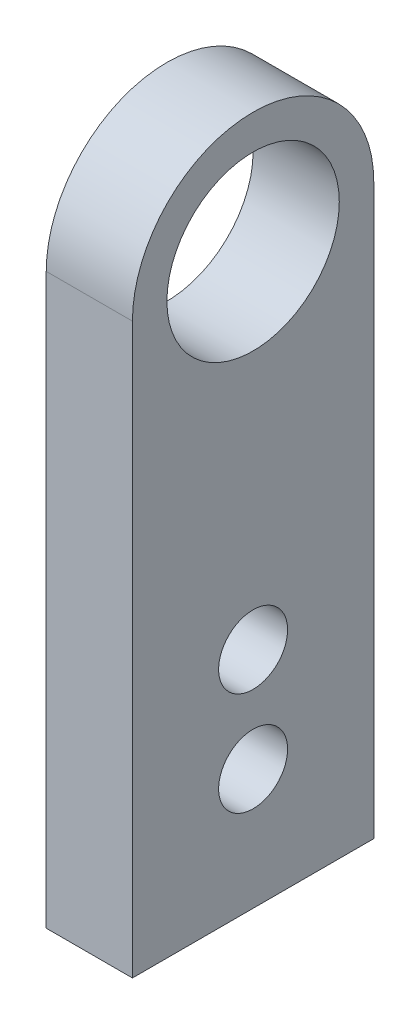
ISO-10303-21;
HEADER;
FILE_DESCRIPTION(('STEP AP214'),'2;1');
FILE_NAME('part.step','',(''),(''),'','','');
FILE_SCHEMA(('AUTOMOTIVE_DESIGN { 1 0 10303 214 1 1 1 1 }'));
ENDSEC;
DATA;
#1=APPLICATION_CONTEXT('core data for automotive mechanical design processes');
#2=APPLICATION_PROTOCOL_DEFINITION('international standard','automotive_design',2000,#1);
#3=PRODUCT_CONTEXT('',#1,'mechanical');
#4=PRODUCT('Part','Part','',(#3));
#5=PRODUCT_RELATED_PRODUCT_CATEGORY('part','',(#4));
#6=PRODUCT_DEFINITION_FORMATION('','',#4);
#7=PRODUCT_DEFINITION_CONTEXT('part definition',#1,'design');
#8=PRODUCT_DEFINITION('design','',#6,#7);
#9=PRODUCT_DEFINITION_SHAPE('','',#8);
#10=(LENGTH_UNIT() NAMED_UNIT(*) SI_UNIT(.MILLI.,.METRE.));
#11=(NAMED_UNIT(*) PLANE_ANGLE_UNIT() SI_UNIT($,.RADIAN.));
#12=(NAMED_UNIT(*) SI_UNIT($,.STERADIAN.) SOLID_ANGLE_UNIT());
#13=UNCERTAINTY_MEASURE_WITH_UNIT(LENGTH_MEASURE(1.E-05),#10,'distance_accuracy_value','');
#14=(GEOMETRIC_REPRESENTATION_CONTEXT(3) GLOBAL_UNCERTAINTY_ASSIGNED_CONTEXT((#13)) GLOBAL_UNIT_ASSIGNED_CONTEXT((#10,
#11,#12)) REPRESENTATION_CONTEXT('',''));
#15=CARTESIAN_POINT('',(0.,0.,0.));
#16=DIRECTION('',(0.,0.,1.));
#17=DIRECTION('',(1.,0.,0.));
#18=AXIS2_PLACEMENT_3D('',#15,#16,#17);
#19=CARTESIAN_POINT('',(5.,33.,0.));
#20=DIRECTION('',(1.,0.,0.));
#21=DIRECTION('',(0.,0.,-1.));
#22=AXIS2_PLACEMENT_3D('',#19,#20,#21);
#23=PLANE('',#22);
#24=CARTESIAN_POINT('',(5.,13.,0.));
#25=DIRECTION('',(1.,0.,0.));
#26=DIRECTION('',(0.,0.,-1.));
#27=AXIS2_PLACEMENT_3D('',#24,#25,#26);
#28=CIRCLE('',#27,2.);
#29=CARTESIAN_POINT('',(5.,13.,-2.));
#30=VERTEX_POINT('',#29);
#31=EDGE_CURVE('E117',#30,#30,#28,.T.);
#32=ORIENTED_EDGE('',*,*,#31,.F.);
#33=EDGE_LOOP('',(#32));
#34=FACE_BOUND('',#33,.T.);
#35=CARTESIAN_POINT('',(5.,33.,0.));
#36=DIRECTION('',(1.,0.,0.));
#37=DIRECTION('',(0.,0.,-1.));
#38=AXIS2_PLACEMENT_3D('',#35,#36,#37);
#39=CIRCLE('',#38,7.);
#40=CARTESIAN_POINT('',(5.,33.,-6.99999999999999));
#41=VERTEX_POINT('',#40);
#42=CARTESIAN_POINT('',(5.,33.,7.));
#43=VERTEX_POINT('',#42);
#44=EDGE_CURVE('E87',#41,#43,#39,.T.);
#45=ORIENTED_EDGE('',*,*,#44,.T.);
#46=DIRECTION('',(0.,-1.,0.));
#47=VECTOR('',#46,1.);
#48=CARTESIAN_POINT('',(5.,33.,7.));
#49=LINE('',#48,#47);
#50=CARTESIAN_POINT('',(5.,0.,7.));
#51=VERTEX_POINT('',#50);
#52=EDGE_CURVE('E82',#43,#51,#49,.T.);
#53=ORIENTED_EDGE('',*,*,#52,.T.);
#54=DIRECTION('',(0.,0.,-1.));
#55=VECTOR('',#54,1.);
#56=CARTESIAN_POINT('',(5.,0.,7.));
#57=LINE('',#56,#55);
#58=CARTESIAN_POINT('',(5.,0.,-7.));
#59=VERTEX_POINT('',#58);
#60=EDGE_CURVE('E85',#51,#59,#57,.T.);
#61=ORIENTED_EDGE('',*,*,#60,.T.);
#62=DIRECTION('',(0.,1.,0.));
#63=VECTOR('',#62,1.);
#64=CARTESIAN_POINT('',(5.,33.,-6.99999999999999));
#65=LINE('',#64,#63);
#66=EDGE_CURVE('E52',#59,#41,#65,.T.);
#67=ORIENTED_EDGE('',*,*,#66,.T.);
#68=EDGE_LOOP('',(#45,#53,#61,#67));
#69=FACE_BOUND('',#68,.T.);
#70=CARTESIAN_POINT('',(5.,33.,0.));
#71=DIRECTION('',(1.,0.,0.));
#72=DIRECTION('',(0.,0.,-1.));
#73=AXIS2_PLACEMENT_3D('',#70,#71,#72);
#74=CIRCLE('',#73,5.);
#75=CARTESIAN_POINT('',(5.,33.,-5.));
#76=VERTEX_POINT('',#75);
#77=EDGE_CURVE('E102',#76,#76,#74,.T.);
#78=ORIENTED_EDGE('',*,*,#77,.F.);
#79=EDGE_LOOP('',(#78));
#80=FACE_BOUND('',#79,.T.);
#81=CARTESIAN_POINT('',(5.,7.,0.));
#82=DIRECTION('',(1.,0.,0.));
#83=DIRECTION('',(0.,0.,-1.));
#84=AXIS2_PLACEMENT_3D('',#81,#82,#83);
#85=CIRCLE('',#84,2.);
#86=CARTESIAN_POINT('',(5.,7.,-2.));
#87=VERTEX_POINT('',#86);
#88=EDGE_CURVE('E123',#87,#87,#85,.T.);
#89=ORIENTED_EDGE('',*,*,#88,.F.);
#90=EDGE_LOOP('',(#89));
#91=FACE_BOUND('',#90,.T.);
#92=ADVANCED_FACE('F35',(#34,#69,#80,#91),#23,.T.);
#93=CARTESIAN_POINT('',(0.,33.,0.));
#94=DIRECTION('',(1.,0.,0.));
#95=DIRECTION('',(0.,0.,-1.));
#96=AXIS2_PLACEMENT_3D('',#93,#94,#95);
#97=PLANE('',#96);
#98=CARTESIAN_POINT('',(0.,33.,0.));
#99=DIRECTION('',(1.,0.,0.));
#100=DIRECTION('',(0.,0.,-1.));
#101=AXIS2_PLACEMENT_3D('',#98,#99,#100);
#102=CIRCLE('',#101,7.);
#103=CARTESIAN_POINT('',(0.,33.,-6.99999999999999));
#104=VERTEX_POINT('',#103);
#105=CARTESIAN_POINT('',(0.,33.,7.));
#106=VERTEX_POINT('',#105);
#107=EDGE_CURVE('E99',#104,#106,#102,.T.);
#108=ORIENTED_EDGE('',*,*,#107,.F.);
#109=DIRECTION('',(0.,1.,0.));
#110=VECTOR('',#109,1.);
#111=CARTESIAN_POINT('',(0.,33.,-6.99999999999999));
#112=LINE('',#111,#110);
#113=CARTESIAN_POINT('',(0.,0.,-7.));
#114=VERTEX_POINT('',#113);
#115=EDGE_CURVE('E75',#114,#104,#112,.T.);
#116=ORIENTED_EDGE('',*,*,#115,.F.);
#117=DIRECTION('',(0.,0.,-1.));
#118=VECTOR('',#117,1.);
#119=CARTESIAN_POINT('',(0.,0.,7.));
#120=LINE('',#119,#118);
#121=CARTESIAN_POINT('',(0.,0.,7.));
#122=VERTEX_POINT('',#121);
#123=EDGE_CURVE('E69',#122,#114,#120,.T.);
#124=ORIENTED_EDGE('',*,*,#123,.F.);
#125=DIRECTION('',(0.,-1.,0.));
#126=VECTOR('',#125,1.);
#127=CARTESIAN_POINT('',(0.,33.,7.));
#128=LINE('',#127,#126);
#129=EDGE_CURVE('E91',#106,#122,#128,.T.);
#130=ORIENTED_EDGE('',*,*,#129,.F.);
#131=EDGE_LOOP('',(#108,#116,#124,#130));
#132=FACE_BOUND('',#131,.T.);
#133=CARTESIAN_POINT('',(0.,33.,0.));
#134=DIRECTION('',(1.,0.,0.));
#135=DIRECTION('',(0.,0.,-1.));
#136=AXIS2_PLACEMENT_3D('',#133,#134,#135);
#137=CIRCLE('',#136,5.);
#138=CARTESIAN_POINT('',(0.,33.,-5.));
#139=VERTEX_POINT('',#138);
#140=EDGE_CURVE('E114',#139,#139,#137,.T.);
#141=ORIENTED_EDGE('',*,*,#140,.T.);
#142=EDGE_LOOP('',(#141));
#143=FACE_BOUND('',#142,.T.);
#144=CARTESIAN_POINT('',(0.,13.,0.));
#145=DIRECTION('',(1.,0.,0.));
#146=DIRECTION('',(0.,0.,-1.));
#147=AXIS2_PLACEMENT_3D('',#144,#145,#146);
#148=CIRCLE('',#147,2.);
#149=CARTESIAN_POINT('',(0.,13.,-2.));
#150=VERTEX_POINT('',#149);
#151=EDGE_CURVE('E120',#150,#150,#148,.T.);
#152=ORIENTED_EDGE('',*,*,#151,.T.);
#153=EDGE_LOOP('',(#152));
#154=FACE_BOUND('',#153,.T.);
#155=CARTESIAN_POINT('',(0.,7.,0.));
#156=DIRECTION('',(1.,0.,0.));
#157=DIRECTION('',(0.,0.,-1.));
#158=AXIS2_PLACEMENT_3D('',#155,#156,#157);
#159=CIRCLE('',#158,2.);
#160=CARTESIAN_POINT('',(0.,7.,-2.));
#161=VERTEX_POINT('',#160);
#162=EDGE_CURVE('E126',#161,#161,#159,.T.);
#163=ORIENTED_EDGE('',*,*,#162,.T.);
#164=EDGE_LOOP('',(#163));
#165=FACE_BOUND('',#164,.T.);
#166=ADVANCED_FACE('F110',(#132,#143,#154,#165),#97,.F.);
#167=CARTESIAN_POINT('',(5.,33.,0.));
#168=DIRECTION('',(-1.,0.,0.));
#169=DIRECTION('',(0.,0.,1.));
#170=AXIS2_PLACEMENT_3D('',#167,#168,#169);
#171=CYLINDRICAL_SURFACE('',#170,7.);
#172=ORIENTED_EDGE('',*,*,#107,.T.);
#173=DIRECTION('',(-1.,0.,0.));
#174=VECTOR('',#173,1.);
#175=CARTESIAN_POINT('',(5.,33.,7.));
#176=LINE('',#175,#174);
#177=EDGE_CURVE('E11',#43,#106,#176,.T.);
#178=ORIENTED_EDGE('',*,*,#177,.F.);
#179=ORIENTED_EDGE('',*,*,#44,.F.);
#180=DIRECTION('',(-1.,0.,0.));
#181=VECTOR('',#180,1.);
#182=CARTESIAN_POINT('',(5.,33.,-6.99999999999999));
#183=LINE('',#182,#181);
#184=EDGE_CURVE('E95',#41,#104,#183,.T.);
#185=ORIENTED_EDGE('',*,*,#184,.T.);
#186=EDGE_LOOP('',(#172,#178,#179,#185));
#187=FACE_BOUND('',#186,.T.);
#188=ADVANCED_FACE('F37',(#187),#171,.T.);
#189=CARTESIAN_POINT('',(5.,33.,7.));
#190=DIRECTION('',(0.,0.,-1.));
#191=DIRECTION('',(0.,1.,0.));
#192=AXIS2_PLACEMENT_3D('',#189,#190,#191);
#193=PLANE('',#192);
#194=ORIENTED_EDGE('',*,*,#129,.T.);
#195=DIRECTION('',(-1.,0.,0.));
#196=VECTOR('',#195,1.);
#197=CARTESIAN_POINT('',(5.,0.,7.));
#198=LINE('',#197,#196);
#199=EDGE_CURVE('E44',#51,#122,#198,.T.);
#200=ORIENTED_EDGE('',*,*,#199,.F.);
#201=ORIENTED_EDGE('',*,*,#52,.F.);
#202=ORIENTED_EDGE('',*,*,#177,.T.);
#203=EDGE_LOOP('',(#194,#200,#201,#202));
#204=FACE_BOUND('',#203,.T.);
#205=ADVANCED_FACE('F90',(#204),#193,.F.);
#206=CARTESIAN_POINT('',(5.,0.,7.));
#207=DIRECTION('',(0.,1.,0.));
#208=DIRECTION('',(0.,0.,1.));
#209=AXIS2_PLACEMENT_3D('',#206,#207,#208);
#210=PLANE('',#209);
#211=ORIENTED_EDGE('',*,*,#123,.T.);
#212=DIRECTION('',(-1.,0.,0.));
#213=VECTOR('',#212,1.);
#214=CARTESIAN_POINT('',(5.,0.,-7.));
#215=LINE('',#214,#213);
#216=EDGE_CURVE('E92',#59,#114,#215,.T.);
#217=ORIENTED_EDGE('',*,*,#216,.F.);
#218=ORIENTED_EDGE('',*,*,#60,.F.);
#219=ORIENTED_EDGE('',*,*,#199,.T.);
#220=EDGE_LOOP('',(#211,#217,#218,#219));
#221=FACE_BOUND('',#220,.T.);
#222=ADVANCED_FACE('F93',(#221),#210,.F.);
#223=CARTESIAN_POINT('',(5.,33.,-6.99999999999999));
#224=DIRECTION('',(0.,0.,1.));
#225=DIRECTION('',(0.,-1.,0.));
#226=AXIS2_PLACEMENT_3D('',#223,#224,#225);
#227=PLANE('',#226);
#228=ORIENTED_EDGE('',*,*,#115,.T.);
#229=ORIENTED_EDGE('',*,*,#184,.F.);
#230=ORIENTED_EDGE('',*,*,#66,.F.);
#231=ORIENTED_EDGE('',*,*,#216,.T.);
#232=EDGE_LOOP('',(#228,#229,#230,#231));
#233=FACE_BOUND('',#232,.T.);
#234=ADVANCED_FACE('F107',(#233),#227,.F.);
#235=CARTESIAN_POINT('',(5.,33.,0.));
#236=DIRECTION('',(-1.,0.,0.));
#237=DIRECTION('',(0.,0.,1.));
#238=AXIS2_PLACEMENT_3D('',#235,#236,#237);
#239=CYLINDRICAL_SURFACE('',#238,5.);
#240=ORIENTED_EDGE('',*,*,#77,.T.);
#241=EDGE_LOOP('',(#240));
#242=FACE_BOUND('',#241,.T.);
#243=ORIENTED_EDGE('',*,*,#140,.F.);
#244=EDGE_LOOP('',(#243));
#245=FACE_BOUND('',#244,.T.);
#246=ADVANCED_FACE('F144',(#242,#245),#239,.F.);
#247=CARTESIAN_POINT('',(5.,13.,0.));
#248=DIRECTION('',(-1.,0.,0.));
#249=DIRECTION('',(0.,0.,1.));
#250=AXIS2_PLACEMENT_3D('',#247,#248,#249);
#251=CYLINDRICAL_SURFACE('',#250,2.);
#252=ORIENTED_EDGE('',*,*,#31,.T.);
#253=EDGE_LOOP('',(#252));
#254=FACE_BOUND('',#253,.T.);
#255=ORIENTED_EDGE('',*,*,#151,.F.);
#256=EDGE_LOOP('',(#255));
#257=FACE_BOUND('',#256,.T.);
#258=ADVANCED_FACE('F190',(#254,#257),#251,.F.);
#259=CARTESIAN_POINT('',(5.,7.,0.));
#260=DIRECTION('',(-1.,0.,0.));
#261=DIRECTION('',(0.,0.,1.));
#262=AXIS2_PLACEMENT_3D('',#259,#260,#261);
#263=CYLINDRICAL_SURFACE('',#262,2.);
#264=ORIENTED_EDGE('',*,*,#88,.T.);
#265=EDGE_LOOP('',(#264));
#266=FACE_BOUND('',#265,.T.);
#267=ORIENTED_EDGE('',*,*,#162,.F.);
#268=EDGE_LOOP('',(#267));
#269=FACE_BOUND('',#268,.T.);
#270=ADVANCED_FACE('F132',(#266,#269),#263,.F.);
#271=CLOSED_SHELL('',(#92,#166,#188,#205,#222,#234,#246,#258,#270));
#272=MANIFOLD_SOLID_BREP('B2',#271);
#273=ADVANCED_BREP_SHAPE_REPRESENTATION('',(#18,#272),#14);
#274=SHAPE_DEFINITION_REPRESENTATION(#9,#273);
ENDSEC;
END-ISO-10303-21;
